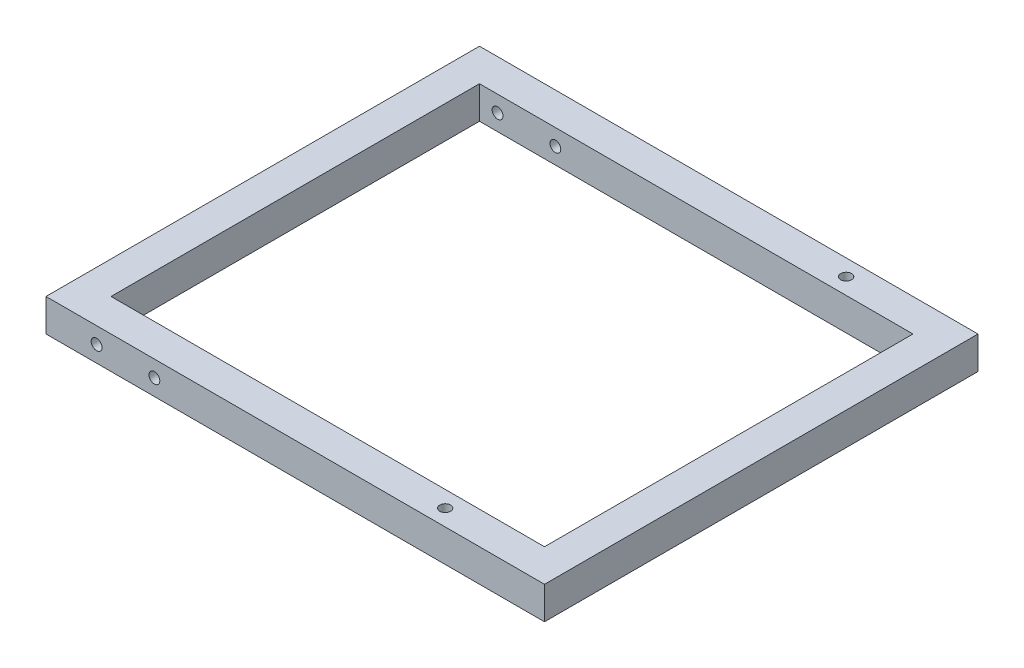
ISO-10303-21;
HEADER;
FILE_DESCRIPTION(('STEP AP214'),'2;1');
FILE_NAME('part.step','',(''),(''),'','','');
FILE_SCHEMA(('AUTOMOTIVE_DESIGN { 1 0 10303 214 1 1 1 1 }'));
ENDSEC;
DATA;
#1=APPLICATION_CONTEXT('core data for automotive mechanical design processes');
#2=APPLICATION_PROTOCOL_DEFINITION('international standard','automotive_design',2000,#1);
#3=PRODUCT_CONTEXT('',#1,'mechanical');
#4=PRODUCT('Part','Part','',(#3));
#5=PRODUCT_RELATED_PRODUCT_CATEGORY('part','',(#4));
#6=PRODUCT_DEFINITION_FORMATION('','',#4);
#7=PRODUCT_DEFINITION_CONTEXT('part definition',#1,'design');
#8=PRODUCT_DEFINITION('design','',#6,#7);
#9=PRODUCT_DEFINITION_SHAPE('','',#8);
#10=(LENGTH_UNIT() NAMED_UNIT(*) SI_UNIT(.MILLI.,.METRE.));
#11=(NAMED_UNIT(*) PLANE_ANGLE_UNIT() SI_UNIT($,.RADIAN.));
#12=(NAMED_UNIT(*) SI_UNIT($,.STERADIAN.) SOLID_ANGLE_UNIT());
#13=UNCERTAINTY_MEASURE_WITH_UNIT(LENGTH_MEASURE(1.E-05),#10,'distance_accuracy_value','');
#14=(GEOMETRIC_REPRESENTATION_CONTEXT(3) GLOBAL_UNCERTAINTY_ASSIGNED_CONTEXT((#13)) GLOBAL_UNIT_ASSIGNED_CONTEXT((#10,
#11,#12)) REPRESENTATION_CONTEXT('',''));
#15=CARTESIAN_POINT('',(0.,0.,0.));
#16=DIRECTION('',(0.,0.,1.));
#17=DIRECTION('',(1.,0.,0.));
#18=AXIS2_PLACEMENT_3D('',#15,#16,#17);
#19=CARTESIAN_POINT('',(0.,28.575,0.));
#20=DIRECTION('',(0.,1.,0.));
#21=DIRECTION('',(0.,0.,1.));
#22=AXIS2_PLACEMENT_3D('',#19,#20,#21);
#23=PLANE('',#22);
#24=CARTESIAN_POINT('',(336.55,28.575,366.7125));
#25=DIRECTION('',(0.,1.,0.));
#26=DIRECTION('',(0.,0.,-1.));
#27=AXIS2_PLACEMENT_3D('',#24,#25,#26);
#28=CIRCLE('',#27,4.76250000000001);
#29=CARTESIAN_POINT('',(336.55,28.575,361.95));
#30=VERTEX_POINT('',#29);
#31=EDGE_CURVE('E191',#30,#30,#28,.T.);
#32=ORIENTED_EDGE('',*,*,#31,.F.);
#33=EDGE_LOOP('',(#32));
#34=FACE_BOUND('',#33,.T.);
#35=CARTESIAN_POINT('',(336.55,28.575,14.2875));
#36=DIRECTION('',(0.,1.,0.));
#37=DIRECTION('',(0.,0.,1.));
#38=AXIS2_PLACEMENT_3D('',#35,#36,#37);
#39=CIRCLE('',#38,4.76250000000001);
#40=CARTESIAN_POINT('',(336.55,28.575,19.05));
#41=VERTEX_POINT('',#40);
#42=EDGE_CURVE('E185',#41,#41,#39,.T.);
#43=ORIENTED_EDGE('',*,*,#42,.F.);
#44=EDGE_LOOP('',(#43));
#45=FACE_BOUND('',#44,.T.);
#46=DIRECTION('',(0.,0.,1.));
#47=VECTOR('',#46,1.);
#48=CARTESIAN_POINT('',(0.,28.575,0.));
#49=LINE('',#48,#47);
#50=CARTESIAN_POINT('',(0.,28.575,0.));
#51=VERTEX_POINT('',#50);
#52=CARTESIAN_POINT('',(0.,28.575,381.));
#53=VERTEX_POINT('',#52);
#54=EDGE_CURVE('E137',#51,#53,#49,.T.);
#55=ORIENTED_EDGE('',*,*,#54,.T.);
#56=DIRECTION('',(1.,0.,0.));
#57=VECTOR('',#56,1.);
#58=CARTESIAN_POINT('',(0.,28.575,381.));
#59=LINE('',#58,#57);
#60=CARTESIAN_POINT('',(438.15,28.575,381.));
#61=VERTEX_POINT('',#60);
#62=EDGE_CURVE('E140',#53,#61,#59,.T.);
#63=ORIENTED_EDGE('',*,*,#62,.T.);
#64=DIRECTION('',(0.,0.,-1.));
#65=VECTOR('',#64,1.);
#66=CARTESIAN_POINT('',(438.15,28.575,0.));
#67=LINE('',#66,#65);
#68=CARTESIAN_POINT('',(438.15,28.575,0.));
#69=VERTEX_POINT('',#68);
#70=EDGE_CURVE('E143',#61,#69,#67,.T.);
#71=ORIENTED_EDGE('',*,*,#70,.T.);
#72=DIRECTION('',(-1.,0.,0.));
#73=VECTOR('',#72,1.);
#74=CARTESIAN_POINT('',(0.,28.575,0.));
#75=LINE('',#74,#73);
#76=EDGE_CURVE('E145',#69,#51,#75,.T.);
#77=ORIENTED_EDGE('',*,*,#76,.T.);
#78=EDGE_LOOP('',(#55,#63,#71,#77));
#79=FACE_BOUND('',#78,.T.);
#80=DIRECTION('',(1.,0.,0.));
#81=VECTOR('',#80,1.);
#82=CARTESIAN_POINT('',(28.575,28.575,352.425));
#83=LINE('',#82,#81);
#84=CARTESIAN_POINT('',(28.575,28.575,352.425));
#85=VERTEX_POINT('',#84);
#86=CARTESIAN_POINT('',(409.575,28.575,352.425));
#87=VERTEX_POINT('',#86);
#88=EDGE_CURVE('E107',#85,#87,#83,.T.);
#89=ORIENTED_EDGE('',*,*,#88,.F.);
#90=DIRECTION('',(0.,0.,1.));
#91=VECTOR('',#90,1.);
#92=CARTESIAN_POINT('',(28.575,28.575,28.575));
#93=LINE('',#92,#91);
#94=CARTESIAN_POINT('',(28.575,28.575,28.575));
#95=VERTEX_POINT('',#94);
#96=EDGE_CURVE('E99',#95,#85,#93,.T.);
#97=ORIENTED_EDGE('',*,*,#96,.F.);
#98=DIRECTION('',(-1.,0.,0.));
#99=VECTOR('',#98,1.);
#100=CARTESIAN_POINT('',(28.575,28.575,28.575));
#101=LINE('',#100,#99);
#102=CARTESIAN_POINT('',(409.575,28.575,28.575));
#103=VERTEX_POINT('',#102);
#104=EDGE_CURVE('E121',#103,#95,#101,.T.);
#105=ORIENTED_EDGE('',*,*,#104,.F.);
#106=DIRECTION('',(0.,0.,-1.));
#107=VECTOR('',#106,1.);
#108=CARTESIAN_POINT('',(409.575,28.575,28.575));
#109=LINE('',#108,#107);
#110=EDGE_CURVE('E119',#87,#103,#109,.T.);
#111=ORIENTED_EDGE('',*,*,#110,.F.);
#112=EDGE_LOOP('',(#89,#97,#105,#111));
#113=FACE_BOUND('',#112,.T.);
#114=ADVANCED_FACE('F32',(#34,#45,#79,#113),#23,.T.);
#115=CARTESIAN_POINT('',(0.,0.,0.));
#116=DIRECTION('',(0.,1.,0.));
#117=DIRECTION('',(0.,0.,1.));
#118=AXIS2_PLACEMENT_3D('',#115,#116,#117);
#119=PLANE('',#118);
#120=CARTESIAN_POINT('',(336.55,0.,366.7125));
#121=DIRECTION('',(0.,1.,0.));
#122=DIRECTION('',(0.,0.,-1.));
#123=AXIS2_PLACEMENT_3D('',#120,#121,#122);
#124=CIRCLE('',#123,4.76250000000001);
#125=CARTESIAN_POINT('',(336.55,0.,361.95));
#126=VERTEX_POINT('',#125);
#127=EDGE_CURVE('E188',#126,#126,#124,.T.);
#128=ORIENTED_EDGE('',*,*,#127,.T.);
#129=EDGE_LOOP('',(#128));
#130=FACE_BOUND('',#129,.T.);
#131=CARTESIAN_POINT('',(336.55,0.,14.2875));
#132=DIRECTION('',(0.,1.,0.));
#133=DIRECTION('',(0.,0.,1.));
#134=AXIS2_PLACEMENT_3D('',#131,#132,#133);
#135=CIRCLE('',#134,4.76250000000001);
#136=CARTESIAN_POINT('',(336.55,0.,19.05));
#137=VERTEX_POINT('',#136);
#138=EDGE_CURVE('E182',#137,#137,#135,.T.);
#139=ORIENTED_EDGE('',*,*,#138,.T.);
#140=EDGE_LOOP('',(#139));
#141=FACE_BOUND('',#140,.T.);
#142=DIRECTION('',(0.,0.,1.));
#143=VECTOR('',#142,1.);
#144=CARTESIAN_POINT('',(0.,0.,0.));
#145=LINE('',#144,#143);
#146=CARTESIAN_POINT('',(0.,0.,0.));
#147=VERTEX_POINT('',#146);
#148=CARTESIAN_POINT('',(0.,0.,381.));
#149=VERTEX_POINT('',#148);
#150=EDGE_CURVE('E115',#147,#149,#145,.T.);
#151=ORIENTED_EDGE('',*,*,#150,.F.);
#152=DIRECTION('',(-1.,0.,0.));
#153=VECTOR('',#152,1.);
#154=CARTESIAN_POINT('',(0.,0.,0.));
#155=LINE('',#154,#153);
#156=CARTESIAN_POINT('',(438.15,0.,0.));
#157=VERTEX_POINT('',#156);
#158=EDGE_CURVE('E141',#157,#147,#155,.T.);
#159=ORIENTED_EDGE('',*,*,#158,.F.);
#160=DIRECTION('',(0.,0.,-1.));
#161=VECTOR('',#160,1.);
#162=CARTESIAN_POINT('',(438.15,0.,0.));
#163=LINE('',#162,#161);
#164=CARTESIAN_POINT('',(438.15,0.,381.));
#165=VERTEX_POINT('',#164);
#166=EDGE_CURVE('E152',#165,#157,#163,.T.);
#167=ORIENTED_EDGE('',*,*,#166,.F.);
#168=DIRECTION('',(1.,0.,0.));
#169=VECTOR('',#168,1.);
#170=CARTESIAN_POINT('',(0.,0.,381.));
#171=LINE('',#170,#169);
#172=EDGE_CURVE('E150',#149,#165,#171,.T.);
#173=ORIENTED_EDGE('',*,*,#172,.F.);
#174=EDGE_LOOP('',(#151,#159,#167,#173));
#175=FACE_BOUND('',#174,.T.);
#176=DIRECTION('',(0.,0.,1.));
#177=VECTOR('',#176,1.);
#178=CARTESIAN_POINT('',(28.575,0.,28.575));
#179=LINE('',#178,#177);
#180=CARTESIAN_POINT('',(28.575,0.,28.575));
#181=VERTEX_POINT('',#180);
#182=CARTESIAN_POINT('',(28.575,0.,352.425));
#183=VERTEX_POINT('',#182);
#184=EDGE_CURVE('E57',#181,#183,#179,.T.);
#185=ORIENTED_EDGE('',*,*,#184,.T.);
#186=DIRECTION('',(1.,0.,0.));
#187=VECTOR('',#186,1.);
#188=CARTESIAN_POINT('',(28.575,0.,352.425));
#189=LINE('',#188,#187);
#190=CARTESIAN_POINT('',(409.575,0.,352.425));
#191=VERTEX_POINT('',#190);
#192=EDGE_CURVE('E114',#183,#191,#189,.T.);
#193=ORIENTED_EDGE('',*,*,#192,.T.);
#194=DIRECTION('',(0.,0.,-1.));
#195=VECTOR('',#194,1.);
#196=CARTESIAN_POINT('',(409.575,0.,28.575));
#197=LINE('',#196,#195);
#198=CARTESIAN_POINT('',(409.575,0.,28.575));
#199=VERTEX_POINT('',#198);
#200=EDGE_CURVE('E129',#191,#199,#197,.T.);
#201=ORIENTED_EDGE('',*,*,#200,.T.);
#202=DIRECTION('',(-1.,0.,0.));
#203=VECTOR('',#202,1.);
#204=CARTESIAN_POINT('',(28.575,0.,28.575));
#205=LINE('',#204,#203);
#206=EDGE_CURVE('E108',#199,#181,#205,.T.);
#207=ORIENTED_EDGE('',*,*,#206,.T.);
#208=EDGE_LOOP('',(#185,#193,#201,#207));
#209=FACE_BOUND('',#208,.T.);
#210=ADVANCED_FACE('F197',(#130,#141,#175,#209),#119,.F.);
#211=CARTESIAN_POINT('',(0.,28.575,0.));
#212=DIRECTION('',(1.,0.,0.));
#213=DIRECTION('',(0.,0.,-1.));
#214=AXIS2_PLACEMENT_3D('',#211,#212,#213);
#215=PLANE('',#214);
#216=ORIENTED_EDGE('',*,*,#150,.T.);
#217=DIRECTION('',(0.,-1.,0.));
#218=VECTOR('',#217,1.);
#219=CARTESIAN_POINT('',(0.,28.575,381.));
#220=LINE('',#219,#218);
#221=EDGE_CURVE('E11',#53,#149,#220,.T.);
#222=ORIENTED_EDGE('',*,*,#221,.F.);
#223=ORIENTED_EDGE('',*,*,#54,.F.);
#224=DIRECTION('',(0.,-1.,0.));
#225=VECTOR('',#224,1.);
#226=CARTESIAN_POINT('',(0.,28.575,0.));
#227=LINE('',#226,#225);
#228=EDGE_CURVE('E147',#51,#147,#227,.T.);
#229=ORIENTED_EDGE('',*,*,#228,.T.);
#230=EDGE_LOOP('',(#216,#222,#223,#229));
#231=FACE_BOUND('',#230,.T.);
#232=ADVANCED_FACE('F34',(#231),#215,.F.);
#233=CARTESIAN_POINT('',(0.,28.575,381.));
#234=DIRECTION('',(0.,0.,-1.));
#235=DIRECTION('',(-1.,0.,0.));
#236=AXIS2_PLACEMENT_3D('',#233,#234,#235);
#237=PLANE('',#236);
#238=CARTESIAN_POINT('',(95.25,14.2875,381.));
#239=DIRECTION('',(0.,0.,-1.));
#240=DIRECTION('',(-1.,0.,0.));
#241=AXIS2_PLACEMENT_3D('',#238,#239,#240);
#242=CIRCLE('',#241,4.7625);
#243=CARTESIAN_POINT('',(90.4875,14.2875,381.));
#244=VERTEX_POINT('',#243);
#245=EDGE_CURVE('E181',#244,#244,#242,.T.);
#246=ORIENTED_EDGE('',*,*,#245,.T.);
#247=EDGE_LOOP('',(#246));
#248=FACE_BOUND('',#247,.T.);
#249=CARTESIAN_POINT('',(44.45,14.2875,381.));
#250=DIRECTION('',(0.,0.,-1.));
#251=DIRECTION('',(-1.,0.,0.));
#252=AXIS2_PLACEMENT_3D('',#249,#250,#251);
#253=CIRCLE('',#252,4.7625);
#254=CARTESIAN_POINT('',(39.6875,14.2875,381.));
#255=VERTEX_POINT('',#254);
#256=EDGE_CURVE('E163',#255,#255,#253,.T.);
#257=ORIENTED_EDGE('',*,*,#256,.T.);
#258=EDGE_LOOP('',(#257));
#259=FACE_BOUND('',#258,.T.);
#260=ORIENTED_EDGE('',*,*,#172,.T.);
#261=DIRECTION('',(0.,-1.,0.));
#262=VECTOR('',#261,1.);
#263=CARTESIAN_POINT('',(438.15,28.575,381.));
#264=LINE('',#263,#262);
#265=EDGE_CURVE('E41',#61,#165,#264,.T.);
#266=ORIENTED_EDGE('',*,*,#265,.F.);
#267=ORIENTED_EDGE('',*,*,#62,.F.);
#268=ORIENTED_EDGE('',*,*,#221,.T.);
#269=EDGE_LOOP('',(#260,#266,#267,#268));
#270=FACE_BOUND('',#269,.T.);
#271=ADVANCED_FACE('F220',(#248,#259,#270),#237,.F.);
#272=CARTESIAN_POINT('',(438.15,28.575,0.));
#273=DIRECTION('',(-1.,0.,0.));
#274=DIRECTION('',(0.,0.,1.));
#275=AXIS2_PLACEMENT_3D('',#272,#273,#274);
#276=PLANE('',#275);
#277=ORIENTED_EDGE('',*,*,#166,.T.);
#278=DIRECTION('',(0.,-1.,0.));
#279=VECTOR('',#278,1.);
#280=CARTESIAN_POINT('',(438.15,28.575,0.));
#281=LINE('',#280,#279);
#282=EDGE_CURVE('E157',#69,#157,#281,.T.);
#283=ORIENTED_EDGE('',*,*,#282,.F.);
#284=ORIENTED_EDGE('',*,*,#70,.F.);
#285=ORIENTED_EDGE('',*,*,#265,.T.);
#286=EDGE_LOOP('',(#277,#283,#284,#285));
#287=FACE_BOUND('',#286,.T.);
#288=ADVANCED_FACE('F225',(#287),#276,.F.);
#289=CARTESIAN_POINT('',(0.,28.575,0.));
#290=DIRECTION('',(0.,0.,1.));
#291=DIRECTION('',(1.,0.,0.));
#292=AXIS2_PLACEMENT_3D('',#289,#290,#291);
#293=PLANE('',#292);
#294=CARTESIAN_POINT('',(95.25,14.2875,0.));
#295=DIRECTION('',(0.,0.,-1.));
#296=DIRECTION('',(-1.,0.,0.));
#297=AXIS2_PLACEMENT_3D('',#294,#295,#296);
#298=CIRCLE('',#297,4.7625);
#299=CARTESIAN_POINT('',(90.4875,14.2875,0.));
#300=VERTEX_POINT('',#299);
#301=EDGE_CURVE('E178',#300,#300,#298,.T.);
#302=ORIENTED_EDGE('',*,*,#301,.F.);
#303=EDGE_LOOP('',(#302));
#304=FACE_BOUND('',#303,.T.);
#305=CARTESIAN_POINT('',(44.45,14.2875,0.));
#306=DIRECTION('',(0.,0.,-1.));
#307=DIRECTION('',(-1.,0.,0.));
#308=AXIS2_PLACEMENT_3D('',#305,#306,#307);
#309=CIRCLE('',#308,4.7625);
#310=CARTESIAN_POINT('',(39.6875,14.2875,0.));
#311=VERTEX_POINT('',#310);
#312=EDGE_CURVE('E168',#311,#311,#309,.T.);
#313=ORIENTED_EDGE('',*,*,#312,.F.);
#314=EDGE_LOOP('',(#313));
#315=FACE_BOUND('',#314,.T.);
#316=ORIENTED_EDGE('',*,*,#158,.T.);
#317=ORIENTED_EDGE('',*,*,#228,.F.);
#318=ORIENTED_EDGE('',*,*,#76,.F.);
#319=ORIENTED_EDGE('',*,*,#282,.T.);
#320=EDGE_LOOP('',(#316,#317,#318,#319));
#321=FACE_BOUND('',#320,.T.);
#322=ADVANCED_FACE('F228',(#304,#315,#321),#293,.F.);
#323=CARTESIAN_POINT('',(28.575,28.575,28.575));
#324=DIRECTION('',(1.,0.,0.));
#325=DIRECTION('',(0.,0.,-1.));
#326=AXIS2_PLACEMENT_3D('',#323,#324,#325);
#327=PLANE('',#326);
#328=ORIENTED_EDGE('',*,*,#184,.F.);
#329=DIRECTION('',(0.,-1.,0.));
#330=VECTOR('',#329,1.);
#331=CARTESIAN_POINT('',(28.575,28.575,28.575));
#332=LINE('',#331,#330);
#333=EDGE_CURVE('E103',#95,#181,#332,.T.);
#334=ORIENTED_EDGE('',*,*,#333,.F.);
#335=ORIENTED_EDGE('',*,*,#96,.T.);
#336=DIRECTION('',(0.,-1.,0.));
#337=VECTOR('',#336,1.);
#338=CARTESIAN_POINT('',(28.575,28.575,352.425));
#339=LINE('',#338,#337);
#340=EDGE_CURVE('E102',#85,#183,#339,.T.);
#341=ORIENTED_EDGE('',*,*,#340,.T.);
#342=EDGE_LOOP('',(#328,#334,#335,#341));
#343=FACE_BOUND('',#342,.T.);
#344=ADVANCED_FACE('F101',(#343),#327,.T.);
#345=CARTESIAN_POINT('',(28.575,28.575,352.425));
#346=DIRECTION('',(0.,0.,-1.));
#347=DIRECTION('',(-1.,0.,0.));
#348=AXIS2_PLACEMENT_3D('',#345,#346,#347);
#349=PLANE('',#348);
#350=CARTESIAN_POINT('',(95.25,14.2875,352.425));
#351=DIRECTION('',(0.,0.,-1.));
#352=DIRECTION('',(-1.,0.,0.));
#353=AXIS2_PLACEMENT_3D('',#350,#351,#352);
#354=CIRCLE('',#353,4.7625);
#355=CARTESIAN_POINT('',(90.4875,14.2875,352.425));
#356=VERTEX_POINT('',#355);
#357=EDGE_CURVE('E173',#356,#356,#354,.T.);
#358=ORIENTED_EDGE('',*,*,#357,.F.);
#359=EDGE_LOOP('',(#358));
#360=FACE_BOUND('',#359,.T.);
#361=CARTESIAN_POINT('',(44.45,14.2875,352.425));
#362=DIRECTION('',(0.,0.,-1.));
#363=DIRECTION('',(-1.,0.,0.));
#364=AXIS2_PLACEMENT_3D('',#361,#362,#363);
#365=CIRCLE('',#364,4.7625);
#366=CARTESIAN_POINT('',(39.6875,14.2875,352.425));
#367=VERTEX_POINT('',#366);
#368=EDGE_CURVE('E127',#367,#367,#365,.T.);
#369=ORIENTED_EDGE('',*,*,#368,.F.);
#370=EDGE_LOOP('',(#369));
#371=FACE_BOUND('',#370,.T.);
#372=ORIENTED_EDGE('',*,*,#192,.F.);
#373=ORIENTED_EDGE('',*,*,#340,.F.);
#374=ORIENTED_EDGE('',*,*,#88,.T.);
#375=DIRECTION('',(0.,-1.,0.));
#376=VECTOR('',#375,1.);
#377=CARTESIAN_POINT('',(409.575,28.575,352.425));
#378=LINE('',#377,#376);
#379=EDGE_CURVE('E116',#87,#191,#378,.T.);
#380=ORIENTED_EDGE('',*,*,#379,.T.);
#381=EDGE_LOOP('',(#372,#373,#374,#380));
#382=FACE_BOUND('',#381,.T.);
#383=ADVANCED_FACE('F111',(#360,#371,#382),#349,.T.);
#384=CARTESIAN_POINT('',(409.575,28.575,28.575));
#385=DIRECTION('',(-1.,0.,0.));
#386=DIRECTION('',(0.,0.,1.));
#387=AXIS2_PLACEMENT_3D('',#384,#385,#386);
#388=PLANE('',#387);
#389=ORIENTED_EDGE('',*,*,#200,.F.);
#390=ORIENTED_EDGE('',*,*,#379,.F.);
#391=ORIENTED_EDGE('',*,*,#110,.T.);
#392=DIRECTION('',(0.,-1.,0.));
#393=VECTOR('',#392,1.);
#394=CARTESIAN_POINT('',(409.575,28.575,28.575));
#395=LINE('',#394,#393);
#396=EDGE_CURVE('E49',#103,#199,#395,.T.);
#397=ORIENTED_EDGE('',*,*,#396,.T.);
#398=EDGE_LOOP('',(#389,#390,#391,#397));
#399=FACE_BOUND('',#398,.T.);
#400=ADVANCED_FACE('F237',(#399),#388,.T.);
#401=CARTESIAN_POINT('',(28.575,28.575,28.575));
#402=DIRECTION('',(0.,0.,1.));
#403=DIRECTION('',(1.,0.,0.));
#404=AXIS2_PLACEMENT_3D('',#401,#402,#403);
#405=PLANE('',#404);
#406=CARTESIAN_POINT('',(95.25,14.2875,28.575));
#407=DIRECTION('',(0.,0.,1.));
#408=DIRECTION('',(1.,0.,0.));
#409=AXIS2_PLACEMENT_3D('',#406,#407,#408);
#410=CIRCLE('',#409,4.7625);
#411=CARTESIAN_POINT('',(100.0125,14.2875,28.575));
#412=VERTEX_POINT('',#411);
#413=EDGE_CURVE('E36',#412,#412,#410,.T.);
#414=ORIENTED_EDGE('',*,*,#413,.F.);
#415=EDGE_LOOP('',(#414));
#416=FACE_BOUND('',#415,.T.);
#417=CARTESIAN_POINT('',(44.45,14.2875,28.575));
#418=DIRECTION('',(0.,0.,1.));
#419=DIRECTION('',(1.,0.,0.));
#420=AXIS2_PLACEMENT_3D('',#417,#418,#419);
#421=CIRCLE('',#420,4.7625);
#422=CARTESIAN_POINT('',(49.2125,14.2875,28.575));
#423=VERTEX_POINT('',#422);
#424=EDGE_CURVE('E161',#423,#423,#421,.T.);
#425=ORIENTED_EDGE('',*,*,#424,.F.);
#426=EDGE_LOOP('',(#425));
#427=FACE_BOUND('',#426,.T.);
#428=ORIENTED_EDGE('',*,*,#206,.F.);
#429=ORIENTED_EDGE('',*,*,#396,.F.);
#430=ORIENTED_EDGE('',*,*,#104,.T.);
#431=ORIENTED_EDGE('',*,*,#333,.T.);
#432=EDGE_LOOP('',(#428,#429,#430,#431));
#433=FACE_BOUND('',#432,.T.);
#434=ADVANCED_FACE('F234',(#416,#427,#433),#405,.T.);
#435=CARTESIAN_POINT('',(44.45,14.2875,381.));
#436=DIRECTION('',(0.,0.,-1.));
#437=DIRECTION('',(-1.,0.,0.));
#438=AXIS2_PLACEMENT_3D('',#435,#436,#437);
#439=CYLINDRICAL_SURFACE('',#438,4.7625);
#440=ORIENTED_EDGE('',*,*,#424,.T.);
#441=EDGE_LOOP('',(#440));
#442=FACE_BOUND('',#441,.T.);
#443=ORIENTED_EDGE('',*,*,#312,.T.);
#444=EDGE_LOOP('',(#443));
#445=FACE_BOUND('',#444,.T.);
#446=ADVANCED_FACE('F236',(#442,#445),#439,.F.);
#447=ORIENTED_EDGE('',*,*,#368,.T.);
#448=EDGE_LOOP('',(#447));
#449=FACE_BOUND('',#448,.T.);
#450=ORIENTED_EDGE('',*,*,#256,.F.);
#451=EDGE_LOOP('',(#450));
#452=FACE_BOUND('',#451,.T.);
#453=ADVANCED_FACE('F244',(#449,#452),#439,.F.);
#454=CARTESIAN_POINT('',(95.25,14.2875,381.));
#455=DIRECTION('',(0.,0.,-1.));
#456=DIRECTION('',(-1.,0.,0.));
#457=AXIS2_PLACEMENT_3D('',#454,#455,#456);
#458=CYLINDRICAL_SURFACE('',#457,4.7625);
#459=ORIENTED_EDGE('',*,*,#413,.T.);
#460=EDGE_LOOP('',(#459));
#461=FACE_BOUND('',#460,.T.);
#462=ORIENTED_EDGE('',*,*,#301,.T.);
#463=EDGE_LOOP('',(#462));
#464=FACE_BOUND('',#463,.T.);
#465=ADVANCED_FACE('F270',(#461,#464),#458,.F.);
#466=ORIENTED_EDGE('',*,*,#357,.T.);
#467=EDGE_LOOP('',(#466));
#468=FACE_BOUND('',#467,.T.);
#469=ORIENTED_EDGE('',*,*,#245,.F.);
#470=EDGE_LOOP('',(#469));
#471=FACE_BOUND('',#470,.T.);
#472=ADVANCED_FACE('F268',(#468,#471),#458,.F.);
#473=CARTESIAN_POINT('',(336.55,0.,14.2875));
#474=DIRECTION('',(0.,1.,0.));
#475=DIRECTION('',(0.,0.,1.));
#476=AXIS2_PLACEMENT_3D('',#473,#474,#475);
#477=CYLINDRICAL_SURFACE('',#476,4.76250000000001);
#478=ORIENTED_EDGE('',*,*,#138,.F.);
#479=EDGE_LOOP('',(#478));
#480=FACE_BOUND('',#479,.T.);
#481=ORIENTED_EDGE('',*,*,#42,.T.);
#482=EDGE_LOOP('',(#481));
#483=FACE_BOUND('',#482,.T.);
#484=ADVANCED_FACE('F203',(#480,#483),#477,.F.);
#485=CARTESIAN_POINT('',(336.55,0.,366.7125));
#486=DIRECTION('',(0.,1.,0.));
#487=DIRECTION('',(0.,0.,1.));
#488=AXIS2_PLACEMENT_3D('',#485,#486,#487);
#489=CYLINDRICAL_SURFACE('',#488,4.76250000000001);
#490=ORIENTED_EDGE('',*,*,#127,.F.);
#491=EDGE_LOOP('',(#490));
#492=FACE_BOUND('',#491,.T.);
#493=ORIENTED_EDGE('',*,*,#31,.T.);
#494=EDGE_LOOP('',(#493));
#495=FACE_BOUND('',#494,.T.);
#496=ADVANCED_FACE('F200',(#492,#495),#489,.F.);
#497=CLOSED_SHELL('',(#114,#210,#232,#271,#288,#322,#344,#383,#400,#434,#446,#453,#465,#472,
#484,#496));
#498=MANIFOLD_SOLID_BREP('B2',#497);
#499=ADVANCED_BREP_SHAPE_REPRESENTATION('',(#18,#498),#14);
#500=SHAPE_DEFINITION_REPRESENTATION(#9,#499);
ENDSEC;
END-ISO-10303-21;
